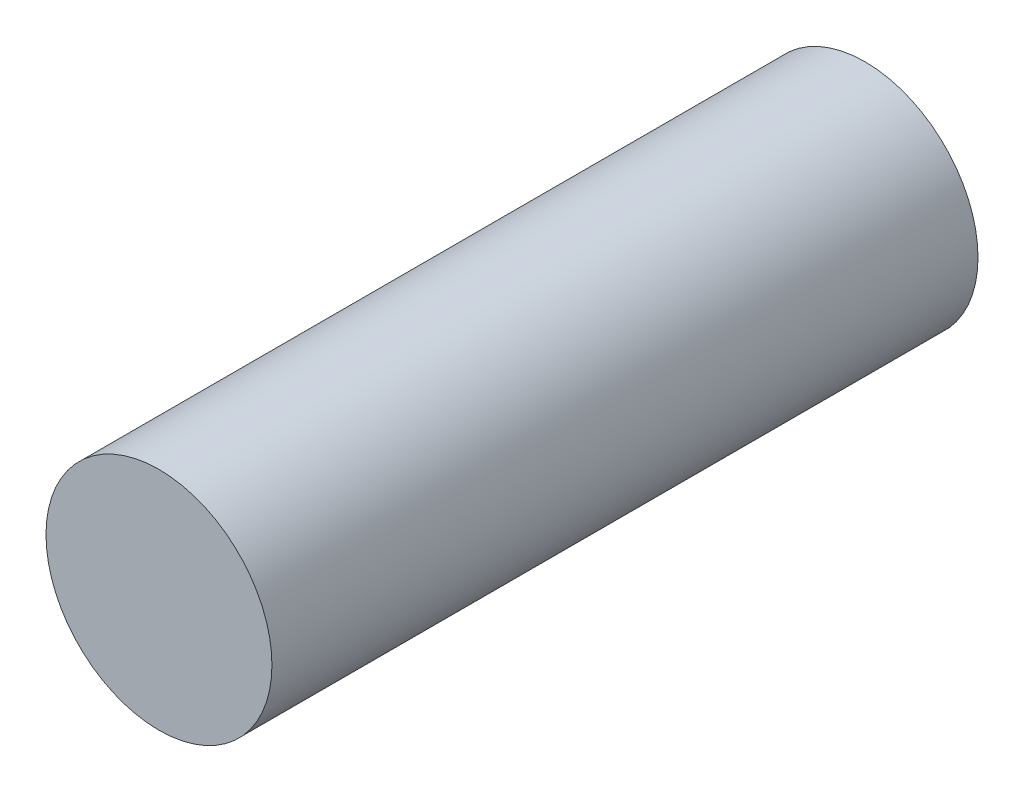
ISO-10303-21;
HEADER;
FILE_DESCRIPTION(('STEP AP214'),'2;1');
FILE_NAME('part.step','',(''),(''),'','','');
FILE_SCHEMA(('AUTOMOTIVE_DESIGN { 1 0 10303 214 1 1 1 1 }'));
ENDSEC;
DATA;
#1=APPLICATION_CONTEXT('core data for automotive mechanical design processes');
#2=APPLICATION_PROTOCOL_DEFINITION('international standard','automotive_design',2000,#1);
#3=PRODUCT_CONTEXT('',#1,'mechanical');
#4=PRODUCT('Part','Part','',(#3));
#5=PRODUCT_RELATED_PRODUCT_CATEGORY('part','',(#4));
#6=PRODUCT_DEFINITION_FORMATION('','',#4);
#7=PRODUCT_DEFINITION_CONTEXT('part definition',#1,'design');
#8=PRODUCT_DEFINITION('design','',#6,#7);
#9=PRODUCT_DEFINITION_SHAPE('','',#8);
#10=(LENGTH_UNIT() NAMED_UNIT(*) SI_UNIT(.MILLI.,.METRE.));
#11=(NAMED_UNIT(*) PLANE_ANGLE_UNIT() SI_UNIT($,.RADIAN.));
#12=(NAMED_UNIT(*) SI_UNIT($,.STERADIAN.) SOLID_ANGLE_UNIT());
#13=UNCERTAINTY_MEASURE_WITH_UNIT(LENGTH_MEASURE(1.E-05),#10,'distance_accuracy_value','');
#14=(GEOMETRIC_REPRESENTATION_CONTEXT(3) GLOBAL_UNCERTAINTY_ASSIGNED_CONTEXT((#13)) GLOBAL_UNIT_ASSIGNED_CONTEXT((#10,
#11,#12)) REPRESENTATION_CONTEXT('',''));
#15=CARTESIAN_POINT('',(0.,0.,0.));
#16=DIRECTION('',(0.,0.,1.));
#17=DIRECTION('',(1.,0.,0.));
#18=AXIS2_PLACEMENT_3D('',#15,#16,#17);
#19=CARTESIAN_POINT('',(0.,0.,25.));
#20=DIRECTION('',(0.,0.,-1.));
#21=DIRECTION('',(-1.,0.,0.));
#22=AXIS2_PLACEMENT_3D('',#19,#20,#21);
#23=CYLINDRICAL_SURFACE('',#22,4.);
#24=CARTESIAN_POINT('',(0.,0.,25.));
#25=DIRECTION('',(0.,0.,1.));
#26=DIRECTION('',(1.,0.,0.));
#27=AXIS2_PLACEMENT_3D('',#24,#25,#26);
#28=CIRCLE('',#27,4.);
#29=CARTESIAN_POINT('',(4.,0.,25.));
#30=VERTEX_POINT('',#29);
#31=EDGE_CURVE('E10',#30,#30,#28,.T.);
#32=ORIENTED_EDGE('',*,*,#31,.F.);
#33=EDGE_LOOP('',(#32));
#34=FACE_BOUND('',#33,.T.);
#35=CARTESIAN_POINT('',(0.,0.,0.));
#36=DIRECTION('',(0.,0.,1.));
#37=DIRECTION('',(1.,0.,0.));
#38=AXIS2_PLACEMENT_3D('',#35,#36,#37);
#39=CIRCLE('',#38,4.);
#40=CARTESIAN_POINT('',(4.,0.,0.));
#41=VERTEX_POINT('',#40);
#42=EDGE_CURVE('E40',#41,#41,#39,.T.);
#43=ORIENTED_EDGE('',*,*,#42,.T.);
#44=EDGE_LOOP('',(#43));
#45=FACE_BOUND('',#44,.T.);
#46=ADVANCED_FACE('F37',(#34,#45),#23,.T.);
#47=CARTESIAN_POINT('',(0.,0.,25.));
#48=DIRECTION('',(0.,0.,1.));
#49=DIRECTION('',(1.,0.,0.));
#50=AXIS2_PLACEMENT_3D('',#47,#48,#49);
#51=PLANE('',#50);
#52=ORIENTED_EDGE('',*,*,#31,.T.);
#53=EDGE_LOOP('',(#52));
#54=FACE_BOUND('',#53,.T.);
#55=ADVANCED_FACE('F52',(#54),#51,.T.);
#56=CARTESIAN_POINT('',(0.,0.,0.));
#57=DIRECTION('',(0.,0.,1.));
#58=DIRECTION('',(1.,0.,0.));
#59=AXIS2_PLACEMENT_3D('',#56,#57,#58);
#60=PLANE('',#59);
#61=ORIENTED_EDGE('',*,*,#42,.F.);
#62=EDGE_LOOP('',(#61));
#63=FACE_BOUND('',#62,.T.);
#64=ADVANCED_FACE('F50',(#63),#60,.F.);
#65=CLOSED_SHELL('',(#46,#55,#64));
#66=MANIFOLD_SOLID_BREP('B2',#65);
#67=ADVANCED_BREP_SHAPE_REPRESENTATION('',(#18,#66),#14);
#68=SHAPE_DEFINITION_REPRESENTATION(#9,#67);
ENDSEC;
END-ISO-10303-21;
